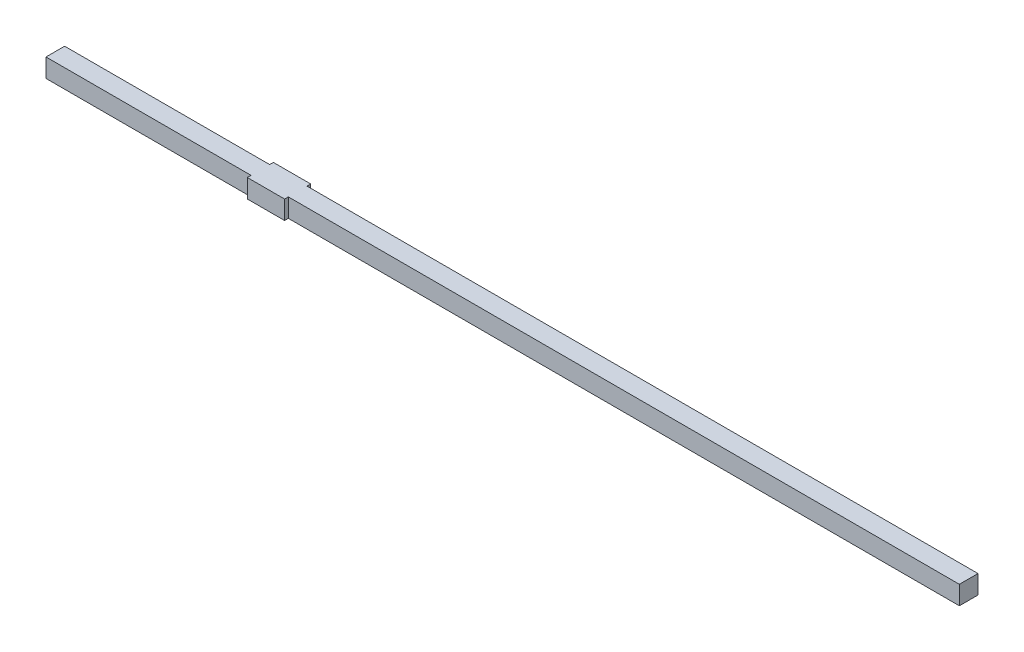
ISO-10303-21;
HEADER;
FILE_DESCRIPTION(('STEP AP214'),'2;1');
FILE_NAME('part.step','',(''),(''),'','','');
FILE_SCHEMA(('AUTOMOTIVE_DESIGN { 1 0 10303 214 1 1 1 1 }'));
ENDSEC;
DATA;
#1=APPLICATION_CONTEXT('core data for automotive mechanical design processes');
#2=APPLICATION_PROTOCOL_DEFINITION('international standard','automotive_design',2000,#1);
#3=PRODUCT_CONTEXT('',#1,'mechanical');
#4=PRODUCT('Part','Part','',(#3));
#5=PRODUCT_RELATED_PRODUCT_CATEGORY('part','',(#4));
#6=PRODUCT_DEFINITION_FORMATION('','',#4);
#7=PRODUCT_DEFINITION_CONTEXT('part definition',#1,'design');
#8=PRODUCT_DEFINITION('design','',#6,#7);
#9=PRODUCT_DEFINITION_SHAPE('','',#8);
#10=(LENGTH_UNIT() NAMED_UNIT(*) SI_UNIT(.MILLI.,.METRE.));
#11=(NAMED_UNIT(*) PLANE_ANGLE_UNIT() SI_UNIT($,.RADIAN.));
#12=(NAMED_UNIT(*) SI_UNIT($,.STERADIAN.) SOLID_ANGLE_UNIT());
#13=UNCERTAINTY_MEASURE_WITH_UNIT(LENGTH_MEASURE(1.E-05),#10,'distance_accuracy_value','');
#14=(GEOMETRIC_REPRESENTATION_CONTEXT(3) GLOBAL_UNCERTAINTY_ASSIGNED_CONTEXT((#13)) GLOBAL_UNIT_ASSIGNED_CONTEXT((#10,
#11,#12)) REPRESENTATION_CONTEXT('',''));
#15=CARTESIAN_POINT('',(0.,0.,0.));
#16=DIRECTION('',(0.,0.,1.));
#17=DIRECTION('',(1.,0.,0.));
#18=AXIS2_PLACEMENT_3D('',#15,#16,#17);
#19=CARTESIAN_POINT('',(0.,0.,0.));
#20=DIRECTION('',(0.,1.,0.));
#21=DIRECTION('',(1.,0.,0.));
#22=AXIS2_PLACEMENT_3D('',#19,#20,#21);
#23=PLANE('',#22);
#24=DIRECTION('',(0.,0.,-1.));
#25=VECTOR('',#24,1.);
#26=CARTESIAN_POINT('',(6.5,0.,0.1));
#27=LINE('',#26,#25);
#28=CARTESIAN_POINT('',(6.5,0.,0.1));
#29=VERTEX_POINT('',#28);
#30=CARTESIAN_POINT('',(6.5,0.,0.));
#31=VERTEX_POINT('',#30);
#32=EDGE_CURVE('E173',#29,#31,#27,.T.);
#33=ORIENTED_EDGE('',*,*,#32,.F.);
#34=DIRECTION('',(1.,0.,0.));
#35=VECTOR('',#34,1.);
#36=CARTESIAN_POINT('',(5.5,0.,0.1));
#37=LINE('',#36,#35);
#38=CARTESIAN_POINT('',(5.5,0.,0.1));
#39=VERTEX_POINT('',#38);
#40=EDGE_CURVE('E172',#39,#29,#37,.T.);
#41=ORIENTED_EDGE('',*,*,#40,.F.);
#42=DIRECTION('',(0.,0.,1.));
#43=VECTOR('',#42,1.);
#44=CARTESIAN_POINT('',(5.5,0.,0.));
#45=LINE('',#44,#43);
#46=CARTESIAN_POINT('',(5.5,0.,0.));
#47=VERTEX_POINT('',#46);
#48=EDGE_CURVE('E149',#47,#39,#45,.T.);
#49=ORIENTED_EDGE('',*,*,#48,.F.);
#50=DIRECTION('',(1.,0.,0.));
#51=VECTOR('',#50,1.);
#52=CARTESIAN_POINT('',(0.,0.,0.));
#53=LINE('',#52,#51);
#54=CARTESIAN_POINT('',(0.,0.,0.));
#55=VERTEX_POINT('',#54);
#56=EDGE_CURVE('E187',#55,#47,#53,.T.);
#57=ORIENTED_EDGE('',*,*,#56,.F.);
#58=DIRECTION('',(0.,0.,1.));
#59=VECTOR('',#58,1.);
#60=CARTESIAN_POINT('',(0.,0.,-0.5));
#61=LINE('',#60,#59);
#62=CARTESIAN_POINT('',(0.,0.,-0.5));
#63=VERTEX_POINT('',#62);
#64=EDGE_CURVE('E93',#63,#55,#61,.T.);
#65=ORIENTED_EDGE('',*,*,#64,.F.);
#66=DIRECTION('',(-1.,0.,0.));
#67=VECTOR('',#66,1.);
#68=CARTESIAN_POINT('',(5.5,0.,-0.5));
#69=LINE('',#68,#67);
#70=CARTESIAN_POINT('',(5.5,0.,-0.5));
#71=VERTEX_POINT('',#70);
#72=EDGE_CURVE('E80',#71,#63,#69,.T.);
#73=ORIENTED_EDGE('',*,*,#72,.F.);
#74=DIRECTION('',(0.,0.,1.));
#75=VECTOR('',#74,1.);
#76=CARTESIAN_POINT('',(5.5,0.,-0.6));
#77=LINE('',#76,#75);
#78=CARTESIAN_POINT('',(5.5,0.,-0.6));
#79=VERTEX_POINT('',#78);
#80=EDGE_CURVE('E124',#79,#71,#77,.T.);
#81=ORIENTED_EDGE('',*,*,#80,.F.);
#82=DIRECTION('',(-1.,0.,0.));
#83=VECTOR('',#82,1.);
#84=CARTESIAN_POINT('',(6.5,0.,-0.6));
#85=LINE('',#84,#83);
#86=CARTESIAN_POINT('',(6.5,0.,-0.6));
#87=VERTEX_POINT('',#86);
#88=EDGE_CURVE('E122',#87,#79,#85,.T.);
#89=ORIENTED_EDGE('',*,*,#88,.F.);
#90=DIRECTION('',(0.,0.,-1.));
#91=VECTOR('',#90,1.);
#92=CARTESIAN_POINT('',(6.5,0.,-0.5));
#93=LINE('',#92,#91);
#94=CARTESIAN_POINT('',(6.5,0.,-0.5));
#95=VERTEX_POINT('',#94);
#96=EDGE_CURVE('E108',#95,#87,#93,.T.);
#97=ORIENTED_EDGE('',*,*,#96,.F.);
#98=DIRECTION('',(-1.,0.,0.));
#99=VECTOR('',#98,1.);
#100=CARTESIAN_POINT('',(24.5,0.,-0.5));
#101=LINE('',#100,#99);
#102=CARTESIAN_POINT('',(24.5,0.,-0.5));
#103=VERTEX_POINT('',#102);
#104=EDGE_CURVE('E27',#103,#95,#101,.T.);
#105=ORIENTED_EDGE('',*,*,#104,.F.);
#106=DIRECTION('',(0.,0.,-1.));
#107=VECTOR('',#106,1.);
#108=CARTESIAN_POINT('',(24.5,0.,0.));
#109=LINE('',#108,#107);
#110=CARTESIAN_POINT('',(24.5,0.,0.));
#111=VERTEX_POINT('',#110);
#112=EDGE_CURVE('E11',#111,#103,#109,.T.);
#113=ORIENTED_EDGE('',*,*,#112,.F.);
#114=DIRECTION('',(1.,0.,0.));
#115=VECTOR('',#114,1.);
#116=CARTESIAN_POINT('',(6.5,0.,0.));
#117=LINE('',#116,#115);
#118=EDGE_CURVE('E211',#31,#111,#117,.T.);
#119=ORIENTED_EDGE('',*,*,#118,.F.);
#120=EDGE_LOOP('',(#33,#41,#49,#57,#65,#73,#81,#89,#97,#105,#113,#119));
#121=FACE_BOUND('',#120,.T.);
#122=ADVANCED_FACE('F16',(#121),#23,.F.);
#123=CARTESIAN_POINT('',(24.5,0.,0.));
#124=DIRECTION('',(1.,0.,0.));
#125=DIRECTION('',(0.,1.,0.));
#126=AXIS2_PLACEMENT_3D('',#123,#124,#125);
#127=PLANE('',#126);
#128=DIRECTION('',(0.,0.,-1.));
#129=VECTOR('',#128,1.);
#130=CARTESIAN_POINT('',(24.5,0.5,0.));
#131=LINE('',#130,#129);
#132=CARTESIAN_POINT('',(24.5,0.5,0.));
#133=VERTEX_POINT('',#132);
#134=CARTESIAN_POINT('',(24.5,0.5,-0.5));
#135=VERTEX_POINT('',#134);
#136=EDGE_CURVE('E181',#133,#135,#131,.T.);
#137=ORIENTED_EDGE('',*,*,#136,.F.);
#138=DIRECTION('',(0.,1.,0.));
#139=VECTOR('',#138,1.);
#140=CARTESIAN_POINT('',(24.5,0.,0.));
#141=LINE('',#140,#139);
#142=EDGE_CURVE('E186',#111,#133,#141,.T.);
#143=ORIENTED_EDGE('',*,*,#142,.F.);
#144=ORIENTED_EDGE('',*,*,#112,.T.);
#145=DIRECTION('',(0.,-1.,0.));
#146=VECTOR('',#145,1.);
#147=CARTESIAN_POINT('',(24.5,0.,-0.5));
#148=LINE('',#147,#146);
#149=EDGE_CURVE('E119',#135,#103,#148,.T.);
#150=ORIENTED_EDGE('',*,*,#149,.F.);
#151=EDGE_LOOP('',(#137,#143,#144,#150));
#152=FACE_BOUND('',#151,.T.);
#153=ADVANCED_FACE('F18',(#152),#127,.T.);
#154=CARTESIAN_POINT('',(24.5,0.,-0.5));
#155=DIRECTION('',(0.,0.,-1.));
#156=DIRECTION('',(0.,-1.,0.));
#157=AXIS2_PLACEMENT_3D('',#154,#155,#156);
#158=PLANE('',#157);
#159=DIRECTION('',(-1.,0.,0.));
#160=VECTOR('',#159,1.);
#161=CARTESIAN_POINT('',(0.,0.5,-0.5));
#162=LINE('',#161,#160);
#163=CARTESIAN_POINT('',(6.5,0.5,-0.5));
#164=VERTEX_POINT('',#163);
#165=EDGE_CURVE('E177',#135,#164,#162,.T.);
#166=ORIENTED_EDGE('',*,*,#165,.F.);
#167=ORIENTED_EDGE('',*,*,#149,.T.);
#168=ORIENTED_EDGE('',*,*,#104,.T.);
#169=DIRECTION('',(0.,-1.,0.));
#170=VECTOR('',#169,1.);
#171=CARTESIAN_POINT('',(6.5,0.,-0.5));
#172=LINE('',#171,#170);
#173=EDGE_CURVE('E116',#164,#95,#172,.T.);
#174=ORIENTED_EDGE('',*,*,#173,.F.);
#175=EDGE_LOOP('',(#166,#167,#168,#174));
#176=FACE_BOUND('',#175,.T.);
#177=ADVANCED_FACE('F290',(#176),#158,.T.);
#178=CARTESIAN_POINT('',(6.5,0.,-0.5));
#179=DIRECTION('',(1.,0.,0.));
#180=DIRECTION('',(0.,1.,0.));
#181=AXIS2_PLACEMENT_3D('',#178,#179,#180);
#182=PLANE('',#181);
#183=DIRECTION('',(0.,0.,-1.));
#184=VECTOR('',#183,1.);
#185=CARTESIAN_POINT('',(6.5,0.5,0.));
#186=LINE('',#185,#184);
#187=CARTESIAN_POINT('',(6.5,0.5,-0.6));
#188=VERTEX_POINT('',#187);
#189=EDGE_CURVE('E174',#164,#188,#186,.T.);
#190=ORIENTED_EDGE('',*,*,#189,.F.);
#191=ORIENTED_EDGE('',*,*,#173,.T.);
#192=ORIENTED_EDGE('',*,*,#96,.T.);
#193=DIRECTION('',(0.,-1.,0.));
#194=VECTOR('',#193,1.);
#195=CARTESIAN_POINT('',(6.5,0.,-0.6));
#196=LINE('',#195,#194);
#197=EDGE_CURVE('E113',#188,#87,#196,.T.);
#198=ORIENTED_EDGE('',*,*,#197,.F.);
#199=EDGE_LOOP('',(#190,#191,#192,#198));
#200=FACE_BOUND('',#199,.T.);
#201=ADVANCED_FACE('F111',(#200),#182,.T.);
#202=CARTESIAN_POINT('',(6.5,0.,-0.6));
#203=DIRECTION('',(0.,0.,-1.));
#204=DIRECTION('',(0.,-1.,0.));
#205=AXIS2_PLACEMENT_3D('',#202,#203,#204);
#206=PLANE('',#205);
#207=DIRECTION('',(-1.,0.,0.));
#208=VECTOR('',#207,1.);
#209=CARTESIAN_POINT('',(0.,0.5,-0.6));
#210=LINE('',#209,#208);
#211=CARTESIAN_POINT('',(5.5,0.5,-0.6));
#212=VERTEX_POINT('',#211);
#213=EDGE_CURVE('E132',#188,#212,#210,.T.);
#214=ORIENTED_EDGE('',*,*,#213,.F.);
#215=ORIENTED_EDGE('',*,*,#197,.T.);
#216=ORIENTED_EDGE('',*,*,#88,.T.);
#217=DIRECTION('',(0.,-1.,0.));
#218=VECTOR('',#217,1.);
#219=CARTESIAN_POINT('',(5.5,0.,-0.6));
#220=LINE('',#219,#218);
#221=EDGE_CURVE('E140',#212,#79,#220,.T.);
#222=ORIENTED_EDGE('',*,*,#221,.F.);
#223=EDGE_LOOP('',(#214,#215,#216,#222));
#224=FACE_BOUND('',#223,.T.);
#225=ADVANCED_FACE('F130',(#224),#206,.T.);
#226=CARTESIAN_POINT('',(5.5,0.,-0.6));
#227=DIRECTION('',(-1.,0.,0.));
#228=DIRECTION('',(0.,0.,1.));
#229=AXIS2_PLACEMENT_3D('',#226,#227,#228);
#230=PLANE('',#229);
#231=DIRECTION('',(0.,0.,1.));
#232=VECTOR('',#231,1.);
#233=CARTESIAN_POINT('',(5.5,0.5,0.));
#234=LINE('',#233,#232);
#235=CARTESIAN_POINT('',(5.5,0.5,-0.5));
#236=VERTEX_POINT('',#235);
#237=EDGE_CURVE('E191',#212,#236,#234,.T.);
#238=ORIENTED_EDGE('',*,*,#237,.F.);
#239=ORIENTED_EDGE('',*,*,#221,.T.);
#240=ORIENTED_EDGE('',*,*,#80,.T.);
#241=DIRECTION('',(0.,-1.,0.));
#242=VECTOR('',#241,1.);
#243=CARTESIAN_POINT('',(5.5,0.,-0.5));
#244=LINE('',#243,#242);
#245=EDGE_CURVE('E148',#236,#71,#244,.T.);
#246=ORIENTED_EDGE('',*,*,#245,.F.);
#247=EDGE_LOOP('',(#238,#239,#240,#246));
#248=FACE_BOUND('',#247,.T.);
#249=ADVANCED_FACE('F283',(#248),#230,.T.);
#250=CARTESIAN_POINT('',(5.5,0.,-0.5));
#251=DIRECTION('',(0.,0.,-1.));
#252=DIRECTION('',(0.,-1.,0.));
#253=AXIS2_PLACEMENT_3D('',#250,#251,#252);
#254=PLANE('',#253);
#255=DIRECTION('',(-1.,0.,0.));
#256=VECTOR('',#255,1.);
#257=CARTESIAN_POINT('',(0.,0.5,-0.5));
#258=LINE('',#257,#256);
#259=CARTESIAN_POINT('',(0.,0.5,-0.5));
#260=VERTEX_POINT('',#259);
#261=EDGE_CURVE('E195',#236,#260,#258,.T.);
#262=ORIENTED_EDGE('',*,*,#261,.F.);
#263=ORIENTED_EDGE('',*,*,#245,.T.);
#264=ORIENTED_EDGE('',*,*,#72,.T.);
#265=DIRECTION('',(0.,-1.,0.));
#266=VECTOR('',#265,1.);
#267=CARTESIAN_POINT('',(0.,0.,-0.5));
#268=LINE('',#267,#266);
#269=EDGE_CURVE('E189',#260,#63,#268,.T.);
#270=ORIENTED_EDGE('',*,*,#269,.F.);
#271=EDGE_LOOP('',(#262,#263,#264,#270));
#272=FACE_BOUND('',#271,.T.);
#273=ADVANCED_FACE('F465',(#272),#254,.T.);
#274=CARTESIAN_POINT('',(0.,0.,-0.5));
#275=DIRECTION('',(-1.,0.,0.));
#276=DIRECTION('',(0.,0.,1.));
#277=AXIS2_PLACEMENT_3D('',#274,#275,#276);
#278=PLANE('',#277);
#279=DIRECTION('',(0.,0.,1.));
#280=VECTOR('',#279,1.);
#281=CARTESIAN_POINT('',(0.,0.5,0.));
#282=LINE('',#281,#280);
#283=CARTESIAN_POINT('',(0.,0.5,0.));
#284=VERTEX_POINT('',#283);
#285=EDGE_CURVE('E196',#260,#284,#282,.T.);
#286=ORIENTED_EDGE('',*,*,#285,.F.);
#287=ORIENTED_EDGE('',*,*,#269,.T.);
#288=ORIENTED_EDGE('',*,*,#64,.T.);
#289=DIRECTION('',(0.,-1.,0.));
#290=VECTOR('',#289,1.);
#291=CARTESIAN_POINT('',(0.,0.,0.));
#292=LINE('',#291,#290);
#293=EDGE_CURVE('E153',#284,#55,#292,.T.);
#294=ORIENTED_EDGE('',*,*,#293,.F.);
#295=EDGE_LOOP('',(#286,#287,#288,#294));
#296=FACE_BOUND('',#295,.T.);
#297=ADVANCED_FACE('F446',(#296),#278,.T.);
#298=CARTESIAN_POINT('',(0.,0.,0.));
#299=DIRECTION('',(0.,0.,1.));
#300=DIRECTION('',(1.,0.,0.));
#301=AXIS2_PLACEMENT_3D('',#298,#299,#300);
#302=PLANE('',#301);
#303=DIRECTION('',(1.,0.,0.));
#304=VECTOR('',#303,1.);
#305=CARTESIAN_POINT('',(0.,0.5,0.));
#306=LINE('',#305,#304);
#307=CARTESIAN_POINT('',(5.5,0.5,0.));
#308=VERTEX_POINT('',#307);
#309=EDGE_CURVE('E167',#284,#308,#306,.T.);
#310=ORIENTED_EDGE('',*,*,#309,.F.);
#311=ORIENTED_EDGE('',*,*,#293,.T.);
#312=ORIENTED_EDGE('',*,*,#56,.T.);
#313=DIRECTION('',(0.,-1.,0.));
#314=VECTOR('',#313,1.);
#315=CARTESIAN_POINT('',(5.5,0.,0.));
#316=LINE('',#315,#314);
#317=EDGE_CURVE('E20',#308,#47,#316,.T.);
#318=ORIENTED_EDGE('',*,*,#317,.F.);
#319=EDGE_LOOP('',(#310,#311,#312,#318));
#320=FACE_BOUND('',#319,.T.);
#321=ADVANCED_FACE('F408',(#320),#302,.T.);
#322=CARTESIAN_POINT('',(5.5,0.,0.));
#323=DIRECTION('',(-1.,0.,0.));
#324=DIRECTION('',(0.,0.,1.));
#325=AXIS2_PLACEMENT_3D('',#322,#323,#324);
#326=PLANE('',#325);
#327=DIRECTION('',(0.,0.,1.));
#328=VECTOR('',#327,1.);
#329=CARTESIAN_POINT('',(5.5,0.5,0.));
#330=LINE('',#329,#328);
#331=CARTESIAN_POINT('',(5.5,0.5,0.1));
#332=VERTEX_POINT('',#331);
#333=EDGE_CURVE('E159',#308,#332,#330,.T.);
#334=ORIENTED_EDGE('',*,*,#333,.F.);
#335=ORIENTED_EDGE('',*,*,#317,.T.);
#336=ORIENTED_EDGE('',*,*,#48,.T.);
#337=DIRECTION('',(0.,-1.,0.));
#338=VECTOR('',#337,1.);
#339=CARTESIAN_POINT('',(5.5,0.,0.1));
#340=LINE('',#339,#338);
#341=EDGE_CURVE('E168',#332,#39,#340,.T.);
#342=ORIENTED_EDGE('',*,*,#341,.F.);
#343=EDGE_LOOP('',(#334,#335,#336,#342));
#344=FACE_BOUND('',#343,.T.);
#345=ADVANCED_FACE('F402',(#344),#326,.T.);
#346=CARTESIAN_POINT('',(5.5,0.,0.1));
#347=DIRECTION('',(0.,0.,1.));
#348=DIRECTION('',(1.,0.,0.));
#349=AXIS2_PLACEMENT_3D('',#346,#347,#348);
#350=PLANE('',#349);
#351=DIRECTION('',(1.,0.,0.));
#352=VECTOR('',#351,1.);
#353=CARTESIAN_POINT('',(0.,0.5,0.1));
#354=LINE('',#353,#352);
#355=CARTESIAN_POINT('',(6.5,0.5,0.1));
#356=VERTEX_POINT('',#355);
#357=EDGE_CURVE('E154',#332,#356,#354,.T.);
#358=ORIENTED_EDGE('',*,*,#357,.F.);
#359=ORIENTED_EDGE('',*,*,#341,.T.);
#360=ORIENTED_EDGE('',*,*,#40,.T.);
#361=DIRECTION('',(0.,-1.,0.));
#362=VECTOR('',#361,1.);
#363=CARTESIAN_POINT('',(6.5,0.,0.1));
#364=LINE('',#363,#362);
#365=EDGE_CURVE('E182',#356,#29,#364,.T.);
#366=ORIENTED_EDGE('',*,*,#365,.F.);
#367=EDGE_LOOP('',(#358,#359,#360,#366));
#368=FACE_BOUND('',#367,.T.);
#369=ADVANCED_FACE('F407',(#368),#350,.T.);
#370=CARTESIAN_POINT('',(6.5,0.,0.1));
#371=DIRECTION('',(1.,0.,0.));
#372=DIRECTION('',(0.,1.,0.));
#373=AXIS2_PLACEMENT_3D('',#370,#371,#372);
#374=PLANE('',#373);
#375=DIRECTION('',(0.,0.,-1.));
#376=VECTOR('',#375,1.);
#377=CARTESIAN_POINT('',(6.5,0.5,0.));
#378=LINE('',#377,#376);
#379=CARTESIAN_POINT('',(6.5,0.5,0.));
#380=VERTEX_POINT('',#379);
#381=EDGE_CURVE('E160',#356,#380,#378,.T.);
#382=ORIENTED_EDGE('',*,*,#381,.F.);
#383=ORIENTED_EDGE('',*,*,#365,.T.);
#384=ORIENTED_EDGE('',*,*,#32,.T.);
#385=DIRECTION('',(0.,-1.,0.));
#386=VECTOR('',#385,1.);
#387=CARTESIAN_POINT('',(6.5,0.,0.));
#388=LINE('',#387,#386);
#389=EDGE_CURVE('E158',#380,#31,#388,.T.);
#390=ORIENTED_EDGE('',*,*,#389,.F.);
#391=EDGE_LOOP('',(#382,#383,#384,#390));
#392=FACE_BOUND('',#391,.T.);
#393=ADVANCED_FACE('F249',(#392),#374,.T.);
#394=CARTESIAN_POINT('',(6.5,0.,0.));
#395=DIRECTION('',(0.,0.,1.));
#396=DIRECTION('',(1.,0.,0.));
#397=AXIS2_PLACEMENT_3D('',#394,#395,#396);
#398=PLANE('',#397);
#399=DIRECTION('',(1.,0.,0.));
#400=VECTOR('',#399,1.);
#401=CARTESIAN_POINT('',(0.,0.5,0.));
#402=LINE('',#401,#400);
#403=EDGE_CURVE('E144',#380,#133,#402,.T.);
#404=ORIENTED_EDGE('',*,*,#403,.F.);
#405=ORIENTED_EDGE('',*,*,#389,.T.);
#406=ORIENTED_EDGE('',*,*,#118,.T.);
#407=ORIENTED_EDGE('',*,*,#142,.T.);
#408=EDGE_LOOP('',(#404,#405,#406,#407));
#409=FACE_BOUND('',#408,.T.);
#410=ADVANCED_FACE('F239',(#409),#398,.T.);
#411=CARTESIAN_POINT('',(0.,0.5,0.));
#412=DIRECTION('',(0.,1.,0.));
#413=DIRECTION('',(1.,0.,0.));
#414=AXIS2_PLACEMENT_3D('',#411,#412,#413);
#415=PLANE('',#414);
#416=ORIENTED_EDGE('',*,*,#381,.T.);
#417=ORIENTED_EDGE('',*,*,#403,.T.);
#418=ORIENTED_EDGE('',*,*,#136,.T.);
#419=ORIENTED_EDGE('',*,*,#165,.T.);
#420=ORIENTED_EDGE('',*,*,#189,.T.);
#421=ORIENTED_EDGE('',*,*,#213,.T.);
#422=ORIENTED_EDGE('',*,*,#237,.T.);
#423=ORIENTED_EDGE('',*,*,#261,.T.);
#424=ORIENTED_EDGE('',*,*,#285,.T.);
#425=ORIENTED_EDGE('',*,*,#309,.T.);
#426=ORIENTED_EDGE('',*,*,#333,.T.);
#427=ORIENTED_EDGE('',*,*,#357,.T.);
#428=EDGE_LOOP('',(#416,#417,#418,#419,#420,#421,#422,#423,#424,#425,#426,#427));
#429=FACE_BOUND('',#428,.T.);
#430=ADVANCED_FACE('F285',(#429),#415,.T.);
#431=CLOSED_SHELL('',(#122,#153,#177,#201,#225,#249,#273,#297,#321,#345,#369,#393,#410,#430));
#432=MANIFOLD_SOLID_BREP('B1',#431);
#433=ADVANCED_BREP_SHAPE_REPRESENTATION('',(#18,#432),#14);
#434=SHAPE_DEFINITION_REPRESENTATION(#9,#433);
ENDSEC;
END-ISO-10303-21;
